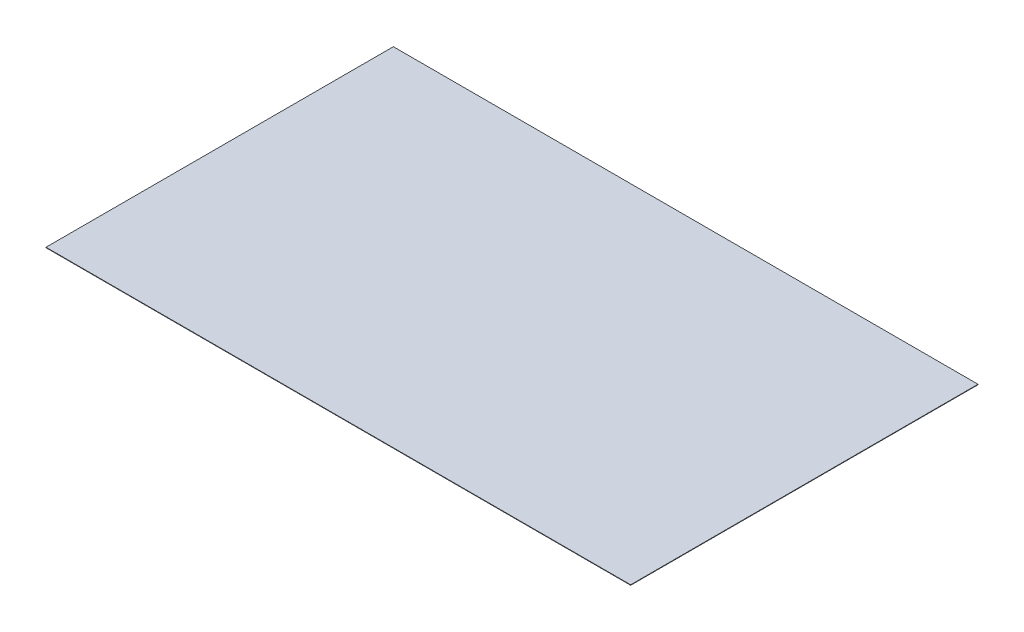
ISO-10303-21;
HEADER;
FILE_DESCRIPTION(('STEP AP214'),'2;1');
FILE_NAME('part.step','',(''),(''),'','','');
FILE_SCHEMA(('AUTOMOTIVE_DESIGN { 1 0 10303 214 1 1 1 1 }'));
ENDSEC;
DATA;
#1=APPLICATION_CONTEXT('core data for automotive mechanical design processes');
#2=APPLICATION_PROTOCOL_DEFINITION('international standard','automotive_design',2000,#1);
#3=PRODUCT_CONTEXT('',#1,'mechanical');
#4=PRODUCT('Part','Part','',(#3));
#5=PRODUCT_RELATED_PRODUCT_CATEGORY('part','',(#4));
#6=PRODUCT_DEFINITION_FORMATION('','',#4);
#7=PRODUCT_DEFINITION_CONTEXT('part definition',#1,'design');
#8=PRODUCT_DEFINITION('design','',#6,#7);
#9=PRODUCT_DEFINITION_SHAPE('','',#8);
#10=(LENGTH_UNIT() NAMED_UNIT(*) SI_UNIT(.MILLI.,.METRE.));
#11=(NAMED_UNIT(*) PLANE_ANGLE_UNIT() SI_UNIT($,.RADIAN.));
#12=(NAMED_UNIT(*) SI_UNIT($,.STERADIAN.) SOLID_ANGLE_UNIT());
#13=UNCERTAINTY_MEASURE_WITH_UNIT(LENGTH_MEASURE(1.E-05),#10,'distance_accuracy_value','');
#14=(GEOMETRIC_REPRESENTATION_CONTEXT(3) GLOBAL_UNCERTAINTY_ASSIGNED_CONTEXT((#13)) GLOBAL_UNIT_ASSIGNED_CONTEXT((#10,
#11,#12)) REPRESENTATION_CONTEXT('',''));
#15=CARTESIAN_POINT('',(0.,0.,0.));
#16=DIRECTION('',(0.,0.,1.));
#17=DIRECTION('',(1.,0.,0.));
#18=AXIS2_PLACEMENT_3D('',#15,#16,#17);
#19=CARTESIAN_POINT('',(62.5,1610.,-757.5));
#20=DIRECTION('',(-1.,0.,0.));
#21=DIRECTION('',(0.,0.,1.));
#22=AXIS2_PLACEMENT_3D('',#19,#20,#21);
#23=PLANE('',#22);
#24=DIRECTION('',(0.,-1.,0.));
#25=VECTOR('',#24,1.);
#26=CARTESIAN_POINT('',(62.5,1610.,0.));
#27=LINE('',#26,#25);
#28=CARTESIAN_POINT('',(62.5,1611.,0.));
#29=VERTEX_POINT('',#28);
#30=CARTESIAN_POINT('',(62.5,1610.,0.));
#31=VERTEX_POINT('',#30);
#32=EDGE_CURVE('E103',#29,#31,#27,.T.);
#33=ORIENTED_EDGE('',*,*,#32,.F.);
#34=DIRECTION('',(0.,0.,1.));
#35=VECTOR('',#34,1.);
#36=CARTESIAN_POINT('',(62.5,1611.,-757.5));
#37=LINE('',#36,#35);
#38=CARTESIAN_POINT('',(62.5,1611.,-757.5));
#39=VERTEX_POINT('',#38);
#40=EDGE_CURVE('E11',#39,#29,#37,.T.);
#41=ORIENTED_EDGE('',*,*,#40,.F.);
#42=DIRECTION('',(0.,-1.,0.));
#43=VECTOR('',#42,1.);
#44=CARTESIAN_POINT('',(62.5,1610.,-757.5));
#45=LINE('',#44,#43);
#46=CARTESIAN_POINT('',(62.5,1610.,-757.5));
#47=VERTEX_POINT('',#46);
#48=EDGE_CURVE('E97',#39,#47,#45,.T.);
#49=ORIENTED_EDGE('',*,*,#48,.T.);
#50=DIRECTION('',(0.,0.,1.));
#51=VECTOR('',#50,1.);
#52=CARTESIAN_POINT('',(62.5,1610.,-757.5));
#53=LINE('',#52,#51);
#54=EDGE_CURVE('E42',#47,#31,#53,.T.);
#55=ORIENTED_EDGE('',*,*,#54,.T.);
#56=EDGE_LOOP('',(#33,#41,#49,#55));
#57=FACE_BOUND('',#56,.T.);
#58=ADVANCED_FACE('F39',(#57),#23,.T.);
#59=CARTESIAN_POINT('',(62.5,1611.,-757.5));
#60=DIRECTION('',(0.,1.,0.));
#61=DIRECTION('',(0.,0.,1.));
#62=AXIS2_PLACEMENT_3D('',#59,#60,#61);
#63=PLANE('',#62);
#64=DIRECTION('',(-1.,0.,0.));
#65=VECTOR('',#64,1.);
#66=CARTESIAN_POINT('',(62.5,1611.,0.));
#67=LINE('',#66,#65);
#68=CARTESIAN_POINT('',(1337.5,1611.,0.));
#69=VERTEX_POINT('',#68);
#70=EDGE_CURVE('E99',#69,#29,#67,.T.);
#71=ORIENTED_EDGE('',*,*,#70,.F.);
#72=DIRECTION('',(0.,0.,1.));
#73=VECTOR('',#72,1.);
#74=CARTESIAN_POINT('',(1337.5,1611.,-757.5));
#75=LINE('',#74,#73);
#76=CARTESIAN_POINT('',(1337.5,1611.,-757.5));
#77=VERTEX_POINT('',#76);
#78=EDGE_CURVE('E48',#77,#69,#75,.T.);
#79=ORIENTED_EDGE('',*,*,#78,.F.);
#80=DIRECTION('',(-1.,0.,0.));
#81=VECTOR('',#80,1.);
#82=CARTESIAN_POINT('',(62.5,1611.,-757.5));
#83=LINE('',#82,#81);
#84=EDGE_CURVE('E94',#77,#39,#83,.T.);
#85=ORIENTED_EDGE('',*,*,#84,.T.);
#86=ORIENTED_EDGE('',*,*,#40,.T.);
#87=EDGE_LOOP('',(#71,#79,#85,#86));
#88=FACE_BOUND('',#87,.T.);
#89=ADVANCED_FACE('F113',(#88),#63,.T.);
#90=CARTESIAN_POINT('',(1337.5,1610.,-757.5));
#91=DIRECTION('',(1.,0.,0.));
#92=DIRECTION('',(0.,0.,-1.));
#93=AXIS2_PLACEMENT_3D('',#90,#91,#92);
#94=PLANE('',#93);
#95=DIRECTION('',(0.,1.,0.));
#96=VECTOR('',#95,1.);
#97=CARTESIAN_POINT('',(1337.5,1610.,0.));
#98=LINE('',#97,#96);
#99=CARTESIAN_POINT('',(1337.5,1610.,0.));
#100=VERTEX_POINT('',#99);
#101=EDGE_CURVE('E89',#100,#69,#98,.T.);
#102=ORIENTED_EDGE('',*,*,#101,.F.);
#103=DIRECTION('',(0.,0.,1.));
#104=VECTOR('',#103,1.);
#105=CARTESIAN_POINT('',(1337.5,1610.,-757.5));
#106=LINE('',#105,#104);
#107=CARTESIAN_POINT('',(1337.5,1610.,-757.5));
#108=VERTEX_POINT('',#107);
#109=EDGE_CURVE('E84',#108,#100,#106,.T.);
#110=ORIENTED_EDGE('',*,*,#109,.F.);
#111=DIRECTION('',(0.,1.,0.));
#112=VECTOR('',#111,1.);
#113=CARTESIAN_POINT('',(1337.5,1610.,-757.5));
#114=LINE('',#113,#112);
#115=EDGE_CURVE('E87',#108,#77,#114,.T.);
#116=ORIENTED_EDGE('',*,*,#115,.T.);
#117=ORIENTED_EDGE('',*,*,#78,.T.);
#118=EDGE_LOOP('',(#102,#110,#116,#117));
#119=FACE_BOUND('',#118,.T.);
#120=ADVANCED_FACE('F86',(#119),#94,.T.);
#121=CARTESIAN_POINT('',(62.5,1610.,-757.5));
#122=DIRECTION('',(0.,-1.,0.));
#123=DIRECTION('',(0.,0.,-1.));
#124=AXIS2_PLACEMENT_3D('',#121,#122,#123);
#125=PLANE('',#124);
#126=DIRECTION('',(1.,0.,0.));
#127=VECTOR('',#126,1.);
#128=CARTESIAN_POINT('',(62.5,1610.,0.));
#129=LINE('',#128,#127);
#130=EDGE_CURVE('E106',#31,#100,#129,.T.);
#131=ORIENTED_EDGE('',*,*,#130,.F.);
#132=ORIENTED_EDGE('',*,*,#54,.F.);
#133=DIRECTION('',(1.,0.,0.));
#134=VECTOR('',#133,1.);
#135=CARTESIAN_POINT('',(62.5,1610.,-757.5));
#136=LINE('',#135,#134);
#137=EDGE_CURVE('E93',#47,#108,#136,.T.);
#138=ORIENTED_EDGE('',*,*,#137,.T.);
#139=ORIENTED_EDGE('',*,*,#109,.T.);
#140=EDGE_LOOP('',(#131,#132,#138,#139));
#141=FACE_BOUND('',#140,.T.);
#142=ADVANCED_FACE('F96',(#141),#125,.T.);
#143=CARTESIAN_POINT('',(0.,0.,-757.5));
#144=DIRECTION('',(0.,0.,-1.));
#145=DIRECTION('',(-1.,0.,0.));
#146=AXIS2_PLACEMENT_3D('',#143,#144,#145);
#147=PLANE('',#146);
#148=ORIENTED_EDGE('',*,*,#48,.F.);
#149=ORIENTED_EDGE('',*,*,#84,.F.);
#150=ORIENTED_EDGE('',*,*,#115,.F.);
#151=ORIENTED_EDGE('',*,*,#137,.F.);
#152=EDGE_LOOP('',(#148,#149,#150,#151));
#153=FACE_BOUND('',#152,.T.);
#154=ADVANCED_FACE('F92',(#153),#147,.T.);
#155=CARTESIAN_POINT('',(0.,0.,0.));
#156=DIRECTION('',(0.,0.,-1.));
#157=DIRECTION('',(-1.,0.,0.));
#158=AXIS2_PLACEMENT_3D('',#155,#156,#157);
#159=PLANE('',#158);
#160=ORIENTED_EDGE('',*,*,#32,.T.);
#161=ORIENTED_EDGE('',*,*,#130,.T.);
#162=ORIENTED_EDGE('',*,*,#101,.T.);
#163=ORIENTED_EDGE('',*,*,#70,.T.);
#164=EDGE_LOOP('',(#160,#161,#162,#163));
#165=FACE_BOUND('',#164,.T.);
#166=ADVANCED_FACE('F112',(#165),#159,.F.);
#167=CLOSED_SHELL('',(#58,#89,#120,#142,#154,#166));
#168=MANIFOLD_SOLID_BREP('B2',#167);
#169=ADVANCED_BREP_SHAPE_REPRESENTATION('',(#18,#168),#14);
#170=SHAPE_DEFINITION_REPRESENTATION(#9,#169);
ENDSEC;
END-ISO-10303-21;
